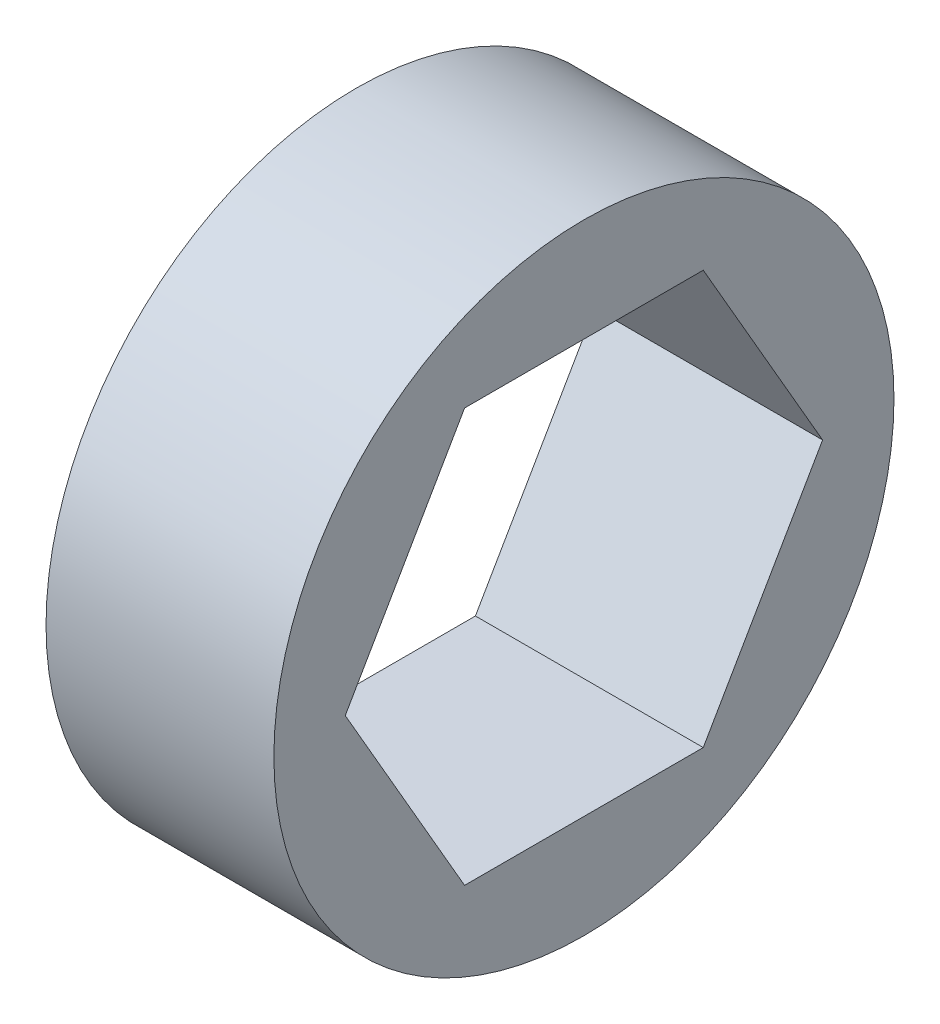
ISO-10303-21;
HEADER;
FILE_DESCRIPTION(('STEP AP214'),'2;1');
FILE_NAME('part.step','',(''),(''),'','','');
FILE_SCHEMA(('AUTOMOTIVE_DESIGN { 1 0 10303 214 1 1 1 1 }'));
ENDSEC;
DATA;
#1=APPLICATION_CONTEXT('core data for automotive mechanical design processes');
#2=APPLICATION_PROTOCOL_DEFINITION('international standard','automotive_design',2000,#1);
#3=PRODUCT_CONTEXT('',#1,'mechanical');
#4=PRODUCT('Part','Part','',(#3));
#5=PRODUCT_RELATED_PRODUCT_CATEGORY('part','',(#4));
#6=PRODUCT_DEFINITION_FORMATION('','',#4);
#7=PRODUCT_DEFINITION_CONTEXT('part definition',#1,'design');
#8=PRODUCT_DEFINITION('design','',#6,#7);
#9=PRODUCT_DEFINITION_SHAPE('','',#8);
#10=(LENGTH_UNIT() NAMED_UNIT(*) SI_UNIT(.MILLI.,.METRE.));
#11=(NAMED_UNIT(*) PLANE_ANGLE_UNIT() SI_UNIT($,.RADIAN.));
#12=(NAMED_UNIT(*) SI_UNIT($,.STERADIAN.) SOLID_ANGLE_UNIT());
#13=UNCERTAINTY_MEASURE_WITH_UNIT(LENGTH_MEASURE(1.E-05),#10,'distance_accuracy_value','');
#14=(GEOMETRIC_REPRESENTATION_CONTEXT(3) GLOBAL_UNCERTAINTY_ASSIGNED_CONTEXT((#13)) GLOBAL_UNIT_ASSIGNED_CONTEXT((#10,
#11,#12)) REPRESENTATION_CONTEXT('',''));
#15=CARTESIAN_POINT('',(0.,0.,0.));
#16=DIRECTION('',(0.,0.,1.));
#17=DIRECTION('',(1.,0.,0.));
#18=AXIS2_PLACEMENT_3D('',#15,#16,#17);
#19=CARTESIAN_POINT('',(3.5,0.,0.));
#20=DIRECTION('',(1.,0.,0.));
#21=DIRECTION('',(0.,0.,-1.));
#22=AXIS2_PLACEMENT_3D('',#19,#20,#21);
#23=PLANE('',#22);
#24=CARTESIAN_POINT('',(3.5,0.,0.));
#25=DIRECTION('',(1.,0.,0.));
#26=DIRECTION('',(0.,0.,-1.));
#27=AXIS2_PLACEMENT_3D('',#24,#25,#26);
#28=CIRCLE('',#27,9.52500000000001);
#29=CARTESIAN_POINT('',(3.5,0.,-9.52500000000001));
#30=VERTEX_POINT('',#29);
#31=EDGE_CURVE('E11',#30,#30,#28,.T.);
#32=ORIENTED_EDGE('',*,*,#31,.T.);
#33=EDGE_LOOP('',(#32));
#34=FACE_BOUND('',#33,.T.);
#35=DIRECTION('',(0.,0.866025403784441,0.499999999999996));
#36=VECTOR('',#35,1.);
#37=CARTESIAN_POINT('',(3.5,0.,-7.33234841870806));
#38=LINE('',#37,#36);
#39=CARTESIAN_POINT('',(3.5,0.,-7.33234841870806));
#40=VERTEX_POINT('',#39);
#41=CARTESIAN_POINT('',(3.5,6.35000000000008,-3.66617420935395));
#42=VERTEX_POINT('',#41);
#43=EDGE_CURVE('E96',#40,#42,#38,.T.);
#44=ORIENTED_EDGE('',*,*,#43,.F.);
#45=DIRECTION('',(0.,0.866025403784443,-0.499999999999992));
#46=VECTOR('',#45,1.);
#47=CARTESIAN_POINT('',(3.5,-6.34999999999999,-3.666174209354));
#48=LINE('',#47,#46);
#49=CARTESIAN_POINT('',(3.5,-6.34999999999999,-3.666174209354));
#50=VERTEX_POINT('',#49);
#51=EDGE_CURVE('E88',#50,#40,#48,.T.);
#52=ORIENTED_EDGE('',*,*,#51,.F.);
#53=DIRECTION('',(0.,0.,-1.));
#54=VECTOR('',#53,1.);
#55=CARTESIAN_POINT('',(3.5,-6.34999999999999,3.66617420935417));
#56=LINE('',#55,#54);
#57=CARTESIAN_POINT('',(3.5,-6.34999999999999,3.66617420935417));
#58=VERTEX_POINT('',#57);
#59=EDGE_CURVE('E116',#58,#50,#56,.T.);
#60=ORIENTED_EDGE('',*,*,#59,.F.);
#61=DIRECTION('',(0.,-0.866025403784438,-0.500000000000001));
#62=VECTOR('',#61,1.);
#63=CARTESIAN_POINT('',(3.5,0.,7.33234841870828));
#64=LINE('',#63,#62);
#65=CARTESIAN_POINT('',(3.5,0.,7.33234841870828));
#66=VERTEX_POINT('',#65);
#67=EDGE_CURVE('E114',#66,#58,#64,.T.);
#68=ORIENTED_EDGE('',*,*,#67,.F.);
#69=DIRECTION('',(0.,-0.86602540378444,0.499999999999998));
#70=VECTOR('',#69,1.);
#71=CARTESIAN_POINT('',(3.5,6.35000000000008,3.66617420935411));
#72=LINE('',#71,#70);
#73=CARTESIAN_POINT('',(3.5,6.35000000000008,3.66617420935411));
#74=VERTEX_POINT('',#73);
#75=EDGE_CURVE('E110',#74,#66,#72,.T.);
#76=ORIENTED_EDGE('',*,*,#75,.F.);
#77=DIRECTION('',(0.,0.,1.));
#78=VECTOR('',#77,1.);
#79=CARTESIAN_POINT('',(3.5,6.35000000000008,-3.66617420935395));
#80=LINE('',#79,#78);
#81=EDGE_CURVE('E108',#42,#74,#80,.T.);
#82=ORIENTED_EDGE('',*,*,#81,.F.);
#83=EDGE_LOOP('',(#44,#52,#60,#68,#76,#82));
#84=FACE_BOUND('',#83,.T.);
#85=ADVANCED_FACE('F35',(#34,#84),#23,.T.);
#86=CARTESIAN_POINT('',(-3.5,0.,0.));
#87=DIRECTION('',(1.,0.,0.));
#88=DIRECTION('',(0.,0.,-1.));
#89=AXIS2_PLACEMENT_3D('',#86,#87,#88);
#90=PLANE('',#89);
#91=CARTESIAN_POINT('',(-3.5,0.,0.));
#92=DIRECTION('',(1.,0.,0.));
#93=DIRECTION('',(0.,0.,-1.));
#94=AXIS2_PLACEMENT_3D('',#91,#92,#93);
#95=CIRCLE('',#94,9.52500000000001);
#96=CARTESIAN_POINT('',(-3.5,0.,-9.52500000000001));
#97=VERTEX_POINT('',#96);
#98=EDGE_CURVE('E39',#97,#97,#95,.T.);
#99=ORIENTED_EDGE('',*,*,#98,.F.);
#100=EDGE_LOOP('',(#99));
#101=FACE_BOUND('',#100,.T.);
#102=DIRECTION('',(0.,0.866025403784443,-0.499999999999992));
#103=VECTOR('',#102,1.);
#104=CARTESIAN_POINT('',(-3.5,-6.34999999999999,-3.666174209354));
#105=LINE('',#104,#103);
#106=CARTESIAN_POINT('',(-3.5,-6.34999999999999,-3.666174209354));
#107=VERTEX_POINT('',#106);
#108=CARTESIAN_POINT('',(-3.5,0.,-7.33234841870806));
#109=VERTEX_POINT('',#108);
#110=EDGE_CURVE('E58',#107,#109,#105,.T.);
#111=ORIENTED_EDGE('',*,*,#110,.T.);
#112=DIRECTION('',(0.,0.866025403784441,0.499999999999996));
#113=VECTOR('',#112,1.);
#114=CARTESIAN_POINT('',(-3.5,0.,-7.33234841870806));
#115=LINE('',#114,#113);
#116=CARTESIAN_POINT('',(-3.5,6.35000000000008,-3.66617420935395));
#117=VERTEX_POINT('',#116);
#118=EDGE_CURVE('E103',#109,#117,#115,.T.);
#119=ORIENTED_EDGE('',*,*,#118,.T.);
#120=DIRECTION('',(0.,0.,1.));
#121=VECTOR('',#120,1.);
#122=CARTESIAN_POINT('',(-3.5,6.35000000000008,-3.66617420935395));
#123=LINE('',#122,#121);
#124=CARTESIAN_POINT('',(-3.5,6.35000000000008,3.66617420935411));
#125=VERTEX_POINT('',#124);
#126=EDGE_CURVE('E120',#117,#125,#123,.T.);
#127=ORIENTED_EDGE('',*,*,#126,.T.);
#128=DIRECTION('',(0.,-0.86602540378444,0.499999999999998));
#129=VECTOR('',#128,1.);
#130=CARTESIAN_POINT('',(-3.5,6.35000000000008,3.66617420935411));
#131=LINE('',#130,#129);
#132=CARTESIAN_POINT('',(-3.5,0.,7.33234841870828));
#133=VERTEX_POINT('',#132);
#134=EDGE_CURVE('E123',#125,#133,#131,.T.);
#135=ORIENTED_EDGE('',*,*,#134,.T.);
#136=DIRECTION('',(0.,-0.866025403784438,-0.500000000000001));
#137=VECTOR('',#136,1.);
#138=CARTESIAN_POINT('',(-3.5,0.,7.33234841870828));
#139=LINE('',#138,#137);
#140=CARTESIAN_POINT('',(-3.5,-6.34999999999999,3.66617420935417));
#141=VERTEX_POINT('',#140);
#142=EDGE_CURVE('E126',#133,#141,#139,.T.);
#143=ORIENTED_EDGE('',*,*,#142,.T.);
#144=DIRECTION('',(0.,0.,-1.));
#145=VECTOR('',#144,1.);
#146=CARTESIAN_POINT('',(-3.5,-6.34999999999999,3.66617420935417));
#147=LINE('',#146,#145);
#148=EDGE_CURVE('E97',#141,#107,#147,.T.);
#149=ORIENTED_EDGE('',*,*,#148,.T.);
#150=EDGE_LOOP('',(#111,#119,#127,#135,#143,#149));
#151=FACE_BOUND('',#150,.T.);
#152=ADVANCED_FACE('F143',(#101,#151),#90,.F.);
#153=CARTESIAN_POINT('',(3.5,0.,0.));
#154=DIRECTION('',(-1.,0.,0.));
#155=DIRECTION('',(0.,0.,1.));
#156=AXIS2_PLACEMENT_3D('',#153,#154,#155);
#157=CYLINDRICAL_SURFACE('',#156,9.52500000000001);
#158=ORIENTED_EDGE('',*,*,#31,.F.);
#159=EDGE_LOOP('',(#158));
#160=FACE_BOUND('',#159,.T.);
#161=ORIENTED_EDGE('',*,*,#98,.T.);
#162=EDGE_LOOP('',(#161));
#163=FACE_BOUND('',#162,.T.);
#164=ADVANCED_FACE('F37',(#160,#163),#157,.T.);
#165=CARTESIAN_POINT('',(3.5,-6.34999999999999,-3.666174209354));
#166=DIRECTION('',(0.,0.499999999999992,0.866025403784443));
#167=DIRECTION('',(0.,-0.866025403784443,0.499999999999992));
#168=AXIS2_PLACEMENT_3D('',#165,#166,#167);
#169=PLANE('',#168);
#170=ORIENTED_EDGE('',*,*,#110,.F.);
#171=DIRECTION('',(-1.,0.,0.));
#172=VECTOR('',#171,1.);
#173=CARTESIAN_POINT('',(3.5,-6.34999999999999,-3.666174209354));
#174=LINE('',#173,#172);
#175=EDGE_CURVE('E92',#50,#107,#174,.T.);
#176=ORIENTED_EDGE('',*,*,#175,.F.);
#177=ORIENTED_EDGE('',*,*,#51,.T.);
#178=DIRECTION('',(-1.,0.,0.));
#179=VECTOR('',#178,1.);
#180=CARTESIAN_POINT('',(3.5,0.,-7.33234841870806));
#181=LINE('',#180,#179);
#182=EDGE_CURVE('E91',#40,#109,#181,.T.);
#183=ORIENTED_EDGE('',*,*,#182,.T.);
#184=EDGE_LOOP('',(#170,#176,#177,#183));
#185=FACE_BOUND('',#184,.T.);
#186=ADVANCED_FACE('F90',(#185),#169,.T.);
#187=CARTESIAN_POINT('',(3.5,0.,-7.33234841870806));
#188=DIRECTION('',(0.,-0.499999999999996,0.866025403784441));
#189=DIRECTION('',(0.,-0.866025403784441,-0.499999999999996));
#190=AXIS2_PLACEMENT_3D('',#187,#188,#189);
#191=PLANE('',#190);
#192=ORIENTED_EDGE('',*,*,#118,.F.);
#193=ORIENTED_EDGE('',*,*,#182,.F.);
#194=ORIENTED_EDGE('',*,*,#43,.T.);
#195=DIRECTION('',(-1.,0.,0.));
#196=VECTOR('',#195,1.);
#197=CARTESIAN_POINT('',(3.5,6.35000000000008,-3.66617420935395));
#198=LINE('',#197,#196);
#199=EDGE_CURVE('E104',#42,#117,#198,.T.);
#200=ORIENTED_EDGE('',*,*,#199,.T.);
#201=EDGE_LOOP('',(#192,#193,#194,#200));
#202=FACE_BOUND('',#201,.T.);
#203=ADVANCED_FACE('F100',(#202),#191,.T.);
#204=CARTESIAN_POINT('',(3.5,6.35000000000008,-3.66617420935395));
#205=DIRECTION('',(0.,-1.,0.));
#206=DIRECTION('',(0.,0.,-1.));
#207=AXIS2_PLACEMENT_3D('',#204,#205,#206);
#208=PLANE('',#207);
#209=ORIENTED_EDGE('',*,*,#126,.F.);
#210=ORIENTED_EDGE('',*,*,#199,.F.);
#211=ORIENTED_EDGE('',*,*,#81,.T.);
#212=DIRECTION('',(-1.,0.,0.));
#213=VECTOR('',#212,1.);
#214=CARTESIAN_POINT('',(3.5,6.35000000000008,3.66617420935411));
#215=LINE('',#214,#213);
#216=EDGE_CURVE('E135',#74,#125,#215,.T.);
#217=ORIENTED_EDGE('',*,*,#216,.T.);
#218=EDGE_LOOP('',(#209,#210,#211,#217));
#219=FACE_BOUND('',#218,.T.);
#220=ADVANCED_FACE('F139',(#219),#208,.T.);
#221=CARTESIAN_POINT('',(3.5,6.35000000000008,3.66617420935411));
#222=DIRECTION('',(0.,-0.499999999999998,-0.86602540378444));
#223=DIRECTION('',(0.,0.86602540378444,-0.499999999999998));
#224=AXIS2_PLACEMENT_3D('',#221,#222,#223);
#225=PLANE('',#224);
#226=ORIENTED_EDGE('',*,*,#134,.F.);
#227=ORIENTED_EDGE('',*,*,#216,.F.);
#228=ORIENTED_EDGE('',*,*,#75,.T.);
#229=DIRECTION('',(-1.,0.,0.));
#230=VECTOR('',#229,1.);
#231=CARTESIAN_POINT('',(3.5,0.,7.33234841870828));
#232=LINE('',#231,#230);
#233=EDGE_CURVE('E133',#66,#133,#232,.T.);
#234=ORIENTED_EDGE('',*,*,#233,.T.);
#235=EDGE_LOOP('',(#226,#227,#228,#234));
#236=FACE_BOUND('',#235,.T.);
#237=ADVANCED_FACE('F151',(#236),#225,.T.);
#238=CARTESIAN_POINT('',(3.5,0.,7.33234841870828));
#239=DIRECTION('',(0.,0.500000000000001,-0.866025403784438));
#240=DIRECTION('',(0.,0.866025403784438,0.500000000000001));
#241=AXIS2_PLACEMENT_3D('',#238,#239,#240);
#242=PLANE('',#241);
#243=ORIENTED_EDGE('',*,*,#142,.F.);
#244=ORIENTED_EDGE('',*,*,#233,.F.);
#245=ORIENTED_EDGE('',*,*,#67,.T.);
#246=DIRECTION('',(-1.,0.,0.));
#247=VECTOR('',#246,1.);
#248=CARTESIAN_POINT('',(3.5,-6.34999999999999,3.66617420935417));
#249=LINE('',#248,#247);
#250=EDGE_CURVE('E50',#58,#141,#249,.T.);
#251=ORIENTED_EDGE('',*,*,#250,.T.);
#252=EDGE_LOOP('',(#243,#244,#245,#251));
#253=FACE_BOUND('',#252,.T.);
#254=ADVANCED_FACE('F149',(#253),#242,.T.);
#255=CARTESIAN_POINT('',(3.5,-6.34999999999999,3.66617420935417));
#256=DIRECTION('',(0.,1.,0.));
#257=DIRECTION('',(0.,0.,1.));
#258=AXIS2_PLACEMENT_3D('',#255,#256,#257);
#259=PLANE('',#258);
#260=ORIENTED_EDGE('',*,*,#148,.F.);
#261=ORIENTED_EDGE('',*,*,#250,.F.);
#262=ORIENTED_EDGE('',*,*,#59,.T.);
#263=ORIENTED_EDGE('',*,*,#175,.T.);
#264=EDGE_LOOP('',(#260,#261,#262,#263));
#265=FACE_BOUND('',#264,.T.);
#266=ADVANCED_FACE('F145',(#265),#259,.T.);
#267=CLOSED_SHELL('',(#85,#152,#164,#186,#203,#220,#237,#254,#266));
#268=MANIFOLD_SOLID_BREP('B2',#267);
#269=ADVANCED_BREP_SHAPE_REPRESENTATION('',(#18,#268),#14);
#270=SHAPE_DEFINITION_REPRESENTATION(#9,#269);
ENDSEC;
END-ISO-10303-21;
